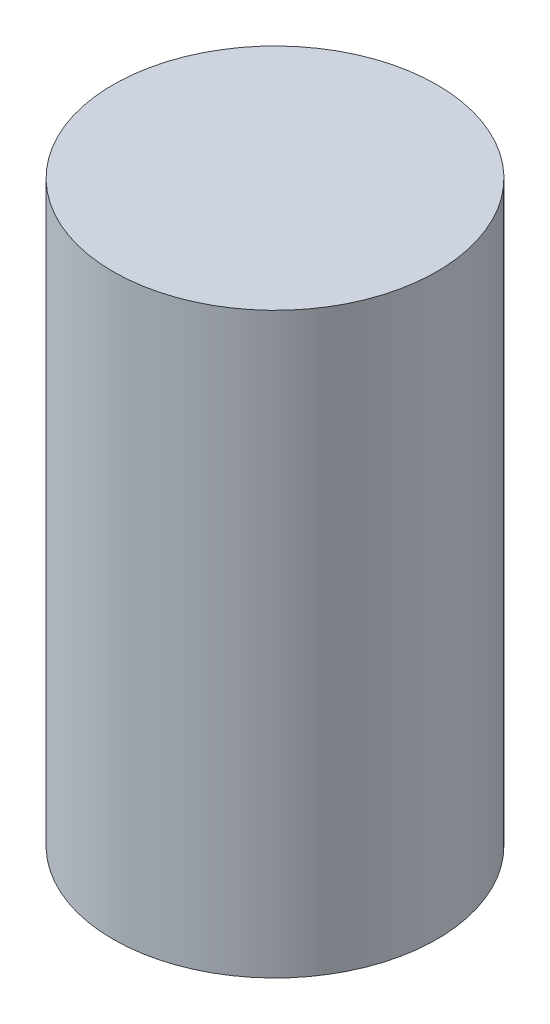
ISO-10303-21;
HEADER;
FILE_DESCRIPTION(('STEP AP214'),'2;1');
FILE_NAME('part.step','',(''),(''),'','','');
FILE_SCHEMA(('AUTOMOTIVE_DESIGN { 1 0 10303 214 1 1 1 1 }'));
ENDSEC;
DATA;
#1=APPLICATION_CONTEXT('core data for automotive mechanical design processes');
#2=APPLICATION_PROTOCOL_DEFINITION('international standard','automotive_design',2000,#1);
#3=PRODUCT_CONTEXT('',#1,'mechanical');
#4=PRODUCT('Part','Part','',(#3));
#5=PRODUCT_RELATED_PRODUCT_CATEGORY('part','',(#4));
#6=PRODUCT_DEFINITION_FORMATION('','',#4);
#7=PRODUCT_DEFINITION_CONTEXT('part definition',#1,'design');
#8=PRODUCT_DEFINITION('design','',#6,#7);
#9=PRODUCT_DEFINITION_SHAPE('','',#8);
#10=(LENGTH_UNIT() NAMED_UNIT(*) SI_UNIT(.MILLI.,.METRE.));
#11=(NAMED_UNIT(*) PLANE_ANGLE_UNIT() SI_UNIT($,.RADIAN.));
#12=(NAMED_UNIT(*) SI_UNIT($,.STERADIAN.) SOLID_ANGLE_UNIT());
#13=UNCERTAINTY_MEASURE_WITH_UNIT(LENGTH_MEASURE(1.E-05),#10,'distance_accuracy_value','');
#14=(GEOMETRIC_REPRESENTATION_CONTEXT(3) GLOBAL_UNCERTAINTY_ASSIGNED_CONTEXT((#13)) GLOBAL_UNIT_ASSIGNED_CONTEXT((#10,
#11,#12)) REPRESENTATION_CONTEXT('',''));
#15=CARTESIAN_POINT('',(0.,0.,0.));
#16=DIRECTION('',(0.,0.,1.));
#17=DIRECTION('',(1.,0.,0.));
#18=AXIS2_PLACEMENT_3D('',#15,#16,#17);
#19=CARTESIAN_POINT('',(0.,38.1,0.));
#20=DIRECTION('',(0.,-1.,0.));
#21=DIRECTION('',(0.,0.,-1.));
#22=AXIS2_PLACEMENT_3D('',#19,#20,#21);
#23=CYLINDRICAL_SURFACE('',#22,10.668);
#24=CARTESIAN_POINT('',(0.,38.1,0.));
#25=DIRECTION('',(0.,1.,0.));
#26=DIRECTION('',(0.,0.,1.));
#27=AXIS2_PLACEMENT_3D('',#24,#25,#26);
#28=CIRCLE('',#27,10.668);
#29=CARTESIAN_POINT('',(0.,38.1,-10.668));
#30=VERTEX_POINT('',#29);
#31=EDGE_CURVE('E10',#30,#30,#28,.T.);
#32=CARTESIAN_POINT('',(0.,0.,0.));
#33=DIRECTION('',(0.,1.,0.));
#34=DIRECTION('',(0.,0.,1.));
#35=AXIS2_PLACEMENT_3D('',#32,#33,#34);
#36=CIRCLE('',#35,10.668);
#37=CARTESIAN_POINT('',(0.,0.,-10.668));
#38=VERTEX_POINT('',#37);
#39=EDGE_CURVE('E33',#38,#38,#36,.T.);
#40=CARTESIAN_POINT('',(0.,38.1,-10.668));
#41=CARTESIAN_POINT('',(0.,37.703125,-10.668));
#42=CARTESIAN_POINT('',(0.,37.30625,-10.668));
#43=CARTESIAN_POINT('',(0.,36.5125,-10.668));
#44=CARTESIAN_POINT('',(0.,36.115625,-10.668));
#45=CARTESIAN_POINT('',(0.,35.321875,-10.668));
#46=CARTESIAN_POINT('',(0.,34.925,-10.668));
#47=CARTESIAN_POINT('',(0.,34.13125,-10.668));
#48=CARTESIAN_POINT('',(0.,33.734375,-10.668));
#49=CARTESIAN_POINT('',(0.,32.940625,-10.668));
#50=CARTESIAN_POINT('',(0.,32.54375,-10.668));
#51=CARTESIAN_POINT('',(0.,31.75,-10.668));
#52=CARTESIAN_POINT('',(0.,31.353125,-10.668));
#53=CARTESIAN_POINT('',(0.,30.559375,-10.668));
#54=CARTESIAN_POINT('',(0.,30.1625,-10.668));
#55=CARTESIAN_POINT('',(0.,29.36875,-10.668));
#56=CARTESIAN_POINT('',(0.,28.971875,-10.668));
#57=CARTESIAN_POINT('',(0.,28.178125,-10.668));
#58=CARTESIAN_POINT('',(0.,27.78125,-10.668));
#59=CARTESIAN_POINT('',(0.,26.9875,-10.668));
#60=CARTESIAN_POINT('',(0.,26.590625,-10.668));
#61=CARTESIAN_POINT('',(0.,25.796875,-10.668));
#62=CARTESIAN_POINT('',(0.,25.4,-10.668));
#63=CARTESIAN_POINT('',(0.,24.60625,-10.668));
#64=CARTESIAN_POINT('',(0.,24.209375,-10.668));
#65=CARTESIAN_POINT('',(0.,23.415625,-10.668));
#66=CARTESIAN_POINT('',(0.,23.01875,-10.668));
#67=CARTESIAN_POINT('',(0.,22.225,-10.668));
#68=CARTESIAN_POINT('',(0.,21.828125,-10.668));
#69=CARTESIAN_POINT('',(0.,21.034375,-10.668));
#70=CARTESIAN_POINT('',(0.,20.6375,-10.668));
#71=CARTESIAN_POINT('',(0.,19.84375,-10.668));
#72=CARTESIAN_POINT('',(0.,19.446875,-10.668));
#73=CARTESIAN_POINT('',(0.,18.653125,-10.668));
#74=CARTESIAN_POINT('',(0.,18.25625,-10.668));
#75=CARTESIAN_POINT('',(0.,17.4625,-10.668));
#76=CARTESIAN_POINT('',(0.,17.065625,-10.668));
#77=CARTESIAN_POINT('',(0.,16.271875,-10.668));
#78=CARTESIAN_POINT('',(0.,15.875,-10.668));
#79=CARTESIAN_POINT('',(0.,15.08125,-10.668));
#80=CARTESIAN_POINT('',(0.,14.684375,-10.668));
#81=CARTESIAN_POINT('',(0.,13.890625,-10.668));
#82=CARTESIAN_POINT('',(0.,13.49375,-10.668));
#83=CARTESIAN_POINT('',(0.,12.7,-10.668));
#84=CARTESIAN_POINT('',(0.,12.303125,-10.668));
#85=CARTESIAN_POINT('',(0.,11.509375,-10.668));
#86=CARTESIAN_POINT('',(0.,11.1125,-10.668));
#87=CARTESIAN_POINT('',(0.,10.31875,-10.668));
#88=CARTESIAN_POINT('',(0.,9.92187499999999,-10.668));
#89=CARTESIAN_POINT('',(0.,9.128125,-10.668));
#90=CARTESIAN_POINT('',(0.,8.73124999999999,-10.668));
#91=CARTESIAN_POINT('',(0.,7.93749999999999,-10.668));
#92=CARTESIAN_POINT('',(0.,7.54062499999999,-10.668));
#93=CARTESIAN_POINT('',(0.,6.746875,-10.668));
#94=CARTESIAN_POINT('',(0.,6.35,-10.668));
#95=CARTESIAN_POINT('',(0.,5.55625,-10.668));
#96=CARTESIAN_POINT('',(0.,5.159375,-10.668));
#97=CARTESIAN_POINT('',(0.,4.365625,-10.668));
#98=CARTESIAN_POINT('',(0.,3.96875,-10.668));
#99=CARTESIAN_POINT('',(0.,3.175,-10.668));
#100=CARTESIAN_POINT('',(0.,2.778125,-10.668));
#101=CARTESIAN_POINT('',(0.,1.984375,-10.668));
#102=CARTESIAN_POINT('',(0.,1.5875,-10.668));
#103=CARTESIAN_POINT('',(0.,0.79375,-10.668));
#104=CARTESIAN_POINT('',(0.,0.396875,-10.668));
#105=CARTESIAN_POINT('',(0.,0.,-10.668));
#106=B_SPLINE_CURVE_WITH_KNOTS('',3,(#40,#41,#42,#43,#44,#45,#46,#47,#48,#49,#50,#51,#52,#53,
#54,#55,#56,#57,#58,#59,#60,#61,#62,#63,#64,#65,#66,#67,#68,#69,#70,#71,#72,#73,#74,#75,#76,#77,
#78,#79,#80,#81,#82,#83,#84,#85,#86,#87,#88,#89,#90,#91,#92,#93,#94,#95,#96,#97,#98,#99,#100,
#101,#102,#103,#104,#105),.UNSPECIFIED.,.F.,.F.,(4,2,2,2,2,2,2,2,2,2,2,2,2,2,2,2,2,2,2,2,2,2,2,
2,2,2,2,2,2,2,2,2,4),(0.,1.190625,2.38125,3.571875,4.7625,5.953125,7.14375,8.334375,
9.52500000000001,10.715625,11.90625,13.096875,14.2875,15.478125,16.66875,17.859375,19.05,
20.240625,21.43125,22.621875,23.8125,25.003125,26.19375,27.384375,28.575,29.765625,30.95625,
32.146875,33.3375,34.528125,35.71875,36.909375,38.1),.UNSPECIFIED.);
#107=EDGE_CURVE('BSEAM30',#30,#38,#106,.T.);
#108=ORIENTED_EDGE('',*,*,#31,.F.);
#109=ORIENTED_EDGE('',*,*,#39,.T.);
#110=ORIENTED_EDGE('',*,*,#107,.T.);
#111=ORIENTED_EDGE('',*,*,#107,.F.);
#112=EDGE_LOOP('',(#108,#110,#109,#111));
#113=FACE_BOUND('',#112,.T.);
#114=ADVANCED_FACE('F30',(#113),#23,.T.);
#115=CARTESIAN_POINT('',(0.,38.1,0.));
#116=DIRECTION('',(0.,1.,0.));
#117=DIRECTION('',(0.,0.,1.));
#118=AXIS2_PLACEMENT_3D('',#115,#116,#117);
#119=PLANE('',#118);
#120=ORIENTED_EDGE('',*,*,#31,.T.);
#121=EDGE_LOOP('',(#120));
#122=FACE_BOUND('',#121,.T.);
#123=ADVANCED_FACE('F45',(#122),#119,.T.);
#124=CARTESIAN_POINT('',(0.,0.,0.));
#125=DIRECTION('',(0.,1.,0.));
#126=DIRECTION('',(0.,0.,1.));
#127=AXIS2_PLACEMENT_3D('',#124,#125,#126);
#128=PLANE('',#127);
#129=ORIENTED_EDGE('',*,*,#39,.F.);
#130=EDGE_LOOP('',(#129));
#131=FACE_BOUND('',#130,.T.);
#132=ADVANCED_FACE('F43',(#131),#128,.F.);
#133=CLOSED_SHELL('',(#114,#123,#132));
#134=MANIFOLD_SOLID_BREP('B2',#133);
#135=ADVANCED_BREP_SHAPE_REPRESENTATION('',(#18,#134),#14);
#136=SHAPE_DEFINITION_REPRESENTATION(#9,#135);
ENDSEC;
END-ISO-10303-21;
